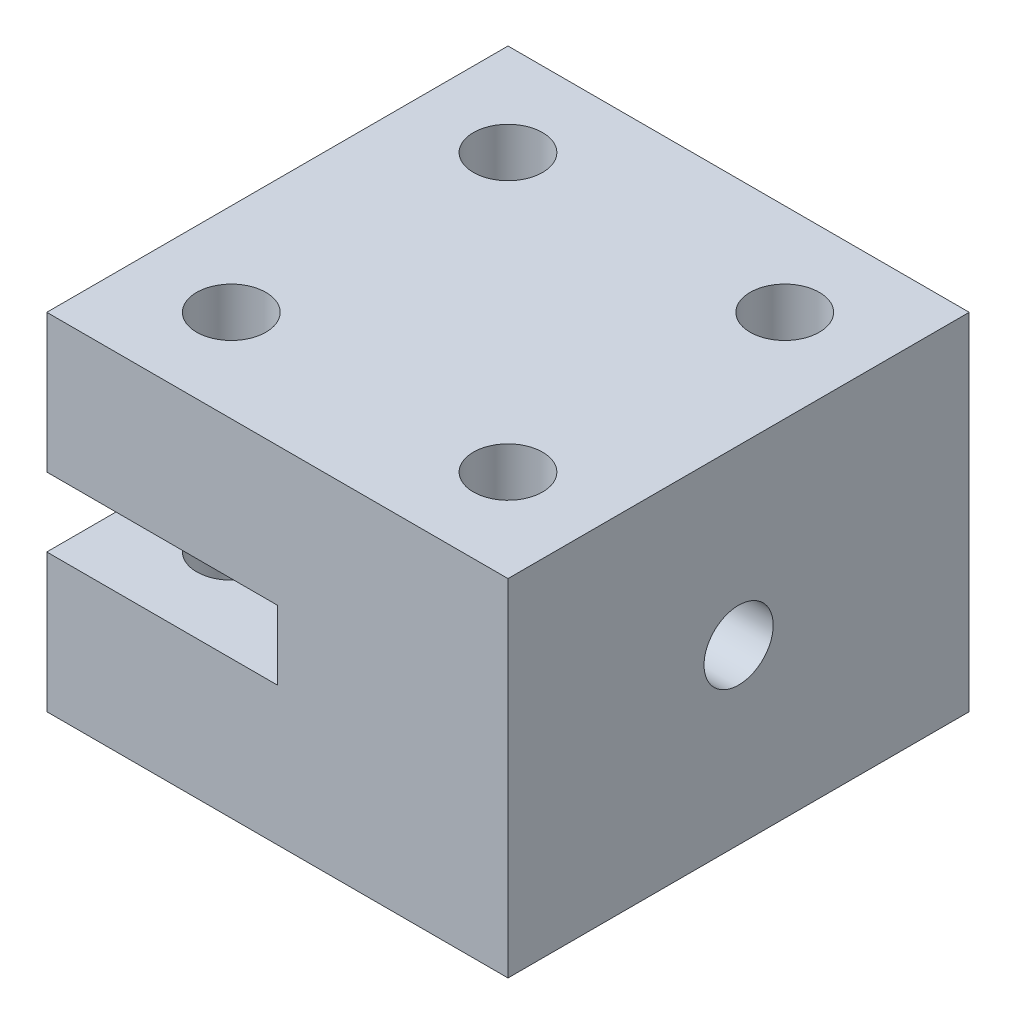
ISO-10303-21;
HEADER;
FILE_DESCRIPTION(('STEP AP214'),'2;1');
FILE_NAME('part.step','',(''),(''),'','','');
FILE_SCHEMA(('AUTOMOTIVE_DESIGN { 1 0 10303 214 1 1 1 1 }'));
ENDSEC;
DATA;
#1=APPLICATION_CONTEXT('core data for automotive mechanical design processes');
#2=APPLICATION_PROTOCOL_DEFINITION('international standard','automotive_design',2000,#1);
#3=PRODUCT_CONTEXT('',#1,'mechanical');
#4=PRODUCT('Part','Part','',(#3));
#5=PRODUCT_RELATED_PRODUCT_CATEGORY('part','',(#4));
#6=PRODUCT_DEFINITION_FORMATION('','',#4);
#7=PRODUCT_DEFINITION_CONTEXT('part definition',#1,'design');
#8=PRODUCT_DEFINITION('design','',#6,#7);
#9=PRODUCT_DEFINITION_SHAPE('','',#8);
#10=(LENGTH_UNIT() NAMED_UNIT(*) SI_UNIT(.MILLI.,.METRE.));
#11=(NAMED_UNIT(*) PLANE_ANGLE_UNIT() SI_UNIT($,.RADIAN.));
#12=(NAMED_UNIT(*) SI_UNIT($,.STERADIAN.) SOLID_ANGLE_UNIT());
#13=UNCERTAINTY_MEASURE_WITH_UNIT(LENGTH_MEASURE(1.E-05),#10,'distance_accuracy_value','');
#14=(GEOMETRIC_REPRESENTATION_CONTEXT(3) GLOBAL_UNCERTAINTY_ASSIGNED_CONTEXT((#13)) GLOBAL_UNIT_ASSIGNED_CONTEXT((#10,
#11,#12)) REPRESENTATION_CONTEXT('',''));
#15=CARTESIAN_POINT('',(0.,0.,0.));
#16=DIRECTION('',(0.,0.,1.));
#17=DIRECTION('',(1.,0.,0.));
#18=AXIS2_PLACEMENT_3D('',#15,#16,#17);
#19=CARTESIAN_POINT('',(9.99999999999999,7.5,-10.));
#20=DIRECTION('',(-1.,0.,0.));
#21=DIRECTION('',(0.,0.,1.));
#22=AXIS2_PLACEMENT_3D('',#19,#20,#21);
#23=PLANE('',#22);
#24=CARTESIAN_POINT('',(9.99999999999999,0.,0.));
#25=DIRECTION('',(1.,0.,0.));
#26=DIRECTION('',(0.,0.,-1.));
#27=AXIS2_PLACEMENT_3D('',#24,#25,#26);
#28=CIRCLE('',#27,1.5);
#29=CARTESIAN_POINT('',(9.99999999999999,0.,-1.5));
#30=VERTEX_POINT('',#29);
#31=EDGE_CURVE('E148',#30,#30,#28,.T.);
#32=ORIENTED_EDGE('',*,*,#31,.F.);
#33=EDGE_LOOP('',(#32));
#34=FACE_BOUND('',#33,.T.);
#35=DIRECTION('',(0.,-1.,0.));
#36=VECTOR('',#35,1.);
#37=CARTESIAN_POINT('',(9.99999999999999,7.5,-10.));
#38=LINE('',#37,#36);
#39=CARTESIAN_POINT('',(9.99999999999999,7.5,-10.));
#40=VERTEX_POINT('',#39);
#41=CARTESIAN_POINT('',(9.99999999999999,-7.5,-10.));
#42=VERTEX_POINT('',#41);
#43=EDGE_CURVE('E74',#40,#42,#38,.T.);
#44=ORIENTED_EDGE('',*,*,#43,.F.);
#45=DIRECTION('',(0.,0.,-1.));
#46=VECTOR('',#45,1.);
#47=CARTESIAN_POINT('',(9.99999999999999,7.5,-10.));
#48=LINE('',#47,#46);
#49=CARTESIAN_POINT('',(9.99999999999999,7.5,10.));
#50=VERTEX_POINT('',#49);
#51=EDGE_CURVE('E136',#50,#40,#48,.T.);
#52=ORIENTED_EDGE('',*,*,#51,.F.);
#53=DIRECTION('',(0.,-1.,0.));
#54=VECTOR('',#53,1.);
#55=CARTESIAN_POINT('',(9.99999999999999,7.5,10.));
#56=LINE('',#55,#54);
#57=CARTESIAN_POINT('',(9.99999999999999,-7.5,10.));
#58=VERTEX_POINT('',#57);
#59=EDGE_CURVE('E35',#50,#58,#56,.T.);
#60=ORIENTED_EDGE('',*,*,#59,.T.);
#61=DIRECTION('',(0.,0.,-1.));
#62=VECTOR('',#61,1.);
#63=CARTESIAN_POINT('',(9.99999999999999,-7.5,-10.));
#64=LINE('',#63,#62);
#65=EDGE_CURVE('E88',#58,#42,#64,.T.);
#66=ORIENTED_EDGE('',*,*,#65,.T.);
#67=EDGE_LOOP('',(#44,#52,#60,#66));
#68=FACE_BOUND('',#67,.T.);
#69=ADVANCED_FACE('F32',(#34,#68),#23,.F.);
#70=CARTESIAN_POINT('',(-10.,7.5,-10.));
#71=DIRECTION('',(0.,0.,1.));
#72=DIRECTION('',(1.,0.,0.));
#73=AXIS2_PLACEMENT_3D('',#70,#71,#72);
#74=PLANE('',#73);
#75=DIRECTION('',(-1.,0.,0.));
#76=VECTOR('',#75,1.);
#77=CARTESIAN_POINT('',(-10.,-1.5,-10.));
#78=LINE('',#77,#76);
#79=CARTESIAN_POINT('',(0.,-1.5,-10.));
#80=VERTEX_POINT('',#79);
#81=CARTESIAN_POINT('',(-10.,-1.5,-10.));
#82=VERTEX_POINT('',#81);
#83=EDGE_CURVE('E105',#80,#82,#78,.T.);
#84=ORIENTED_EDGE('',*,*,#83,.F.);
#85=DIRECTION('',(0.,-1.,0.));
#86=VECTOR('',#85,1.);
#87=CARTESIAN_POINT('',(0.,1.5,-10.));
#88=LINE('',#87,#86);
#89=CARTESIAN_POINT('',(0.,1.5,-10.));
#90=VERTEX_POINT('',#89);
#91=EDGE_CURVE('E116',#90,#80,#88,.T.);
#92=ORIENTED_EDGE('',*,*,#91,.F.);
#93=DIRECTION('',(-1.,0.,0.));
#94=VECTOR('',#93,1.);
#95=CARTESIAN_POINT('',(-10.,1.5,-10.));
#96=LINE('',#95,#94);
#97=CARTESIAN_POINT('',(-10.,1.5,-10.));
#98=VERTEX_POINT('',#97);
#99=EDGE_CURVE('E144',#90,#98,#96,.T.);
#100=ORIENTED_EDGE('',*,*,#99,.T.);
#101=DIRECTION('',(0.,-1.,0.));
#102=VECTOR('',#101,1.);
#103=CARTESIAN_POINT('',(-10.,7.5,-10.));
#104=LINE('',#103,#102);
#105=CARTESIAN_POINT('',(-10.,7.5,-10.));
#106=VERTEX_POINT('',#105);
#107=EDGE_CURVE('E121',#106,#98,#104,.T.);
#108=ORIENTED_EDGE('',*,*,#107,.F.);
#109=DIRECTION('',(-1.,0.,0.));
#110=VECTOR('',#109,1.);
#111=CARTESIAN_POINT('',(-10.,7.5,-10.));
#112=LINE('',#111,#110);
#113=EDGE_CURVE('E83',#40,#106,#112,.T.);
#114=ORIENTED_EDGE('',*,*,#113,.F.);
#115=ORIENTED_EDGE('',*,*,#43,.T.);
#116=DIRECTION('',(-1.,0.,0.));
#117=VECTOR('',#116,1.);
#118=CARTESIAN_POINT('',(-10.,-7.5,-10.));
#119=LINE('',#118,#117);
#120=CARTESIAN_POINT('',(-10.,-7.5,-10.));
#121=VERTEX_POINT('',#120);
#122=EDGE_CURVE('E78',#42,#121,#119,.T.);
#123=ORIENTED_EDGE('',*,*,#122,.T.);
#124=DIRECTION('',(0.,-1.,0.));
#125=VECTOR('',#124,1.);
#126=CARTESIAN_POINT('',(-10.,7.5,-10.));
#127=LINE('',#126,#125);
#128=EDGE_CURVE('E96',#82,#121,#127,.T.);
#129=ORIENTED_EDGE('',*,*,#128,.F.);
#130=EDGE_LOOP('',(#84,#92,#100,#108,#114,#115,#123,#129));
#131=FACE_BOUND('',#130,.T.);
#132=ADVANCED_FACE('F76',(#131),#74,.F.);
#133=CARTESIAN_POINT('',(-10.,7.5,-10.));
#134=DIRECTION('',(1.,0.,0.));
#135=DIRECTION('',(0.,0.,-1.));
#136=AXIS2_PLACEMENT_3D('',#133,#134,#135);
#137=PLANE('',#136);
#138=DIRECTION('',(0.,0.,1.));
#139=VECTOR('',#138,1.);
#140=CARTESIAN_POINT('',(-10.,-1.5,-10.));
#141=LINE('',#140,#139);
#142=CARTESIAN_POINT('',(-10.,-1.5,10.));
#143=VERTEX_POINT('',#142);
#144=EDGE_CURVE('E40',#82,#143,#141,.T.);
#145=ORIENTED_EDGE('',*,*,#144,.F.);
#146=ORIENTED_EDGE('',*,*,#128,.T.);
#147=DIRECTION('',(0.,0.,1.));
#148=VECTOR('',#147,1.);
#149=CARTESIAN_POINT('',(-10.,-7.5,-10.));
#150=LINE('',#149,#148);
#151=CARTESIAN_POINT('',(-10.,-7.5,10.));
#152=VERTEX_POINT('',#151);
#153=EDGE_CURVE('E95',#121,#152,#150,.T.);
#154=ORIENTED_EDGE('',*,*,#153,.T.);
#155=DIRECTION('',(0.,-1.,0.));
#156=VECTOR('',#155,1.);
#157=CARTESIAN_POINT('',(-10.,7.5,10.));
#158=LINE('',#157,#156);
#159=EDGE_CURVE('E108',#143,#152,#158,.T.);
#160=ORIENTED_EDGE('',*,*,#159,.F.);
#161=EDGE_LOOP('',(#145,#146,#154,#160));
#162=FACE_BOUND('',#161,.T.);
#163=ADVANCED_FACE('F244',(#162),#137,.F.);
#164=CARTESIAN_POINT('',(-10.,7.5,10.));
#165=DIRECTION('',(0.,0.,-1.));
#166=DIRECTION('',(-1.,0.,0.));
#167=AXIS2_PLACEMENT_3D('',#164,#165,#166);
#168=PLANE('',#167);
#169=DIRECTION('',(1.,0.,0.));
#170=VECTOR('',#169,1.);
#171=CARTESIAN_POINT('',(-10.,-1.5,10.));
#172=LINE('',#171,#170);
#173=CARTESIAN_POINT('',(0.,-1.5,10.));
#174=VERTEX_POINT('',#173);
#175=EDGE_CURVE('E11',#143,#174,#172,.T.);
#176=ORIENTED_EDGE('',*,*,#175,.F.);
#177=ORIENTED_EDGE('',*,*,#159,.T.);
#178=DIRECTION('',(1.,0.,0.));
#179=VECTOR('',#178,1.);
#180=CARTESIAN_POINT('',(-10.,-7.5,10.));
#181=LINE('',#180,#179);
#182=EDGE_CURVE('E106',#152,#58,#181,.T.);
#183=ORIENTED_EDGE('',*,*,#182,.T.);
#184=ORIENTED_EDGE('',*,*,#59,.F.);
#185=DIRECTION('',(1.,0.,0.));
#186=VECTOR('',#185,1.);
#187=CARTESIAN_POINT('',(-10.,7.5,10.));
#188=LINE('',#187,#186);
#189=CARTESIAN_POINT('',(-10.,7.5,10.));
#190=VERTEX_POINT('',#189);
#191=EDGE_CURVE('E129',#190,#50,#188,.T.);
#192=ORIENTED_EDGE('',*,*,#191,.F.);
#193=DIRECTION('',(0.,-1.,0.));
#194=VECTOR('',#193,1.);
#195=CARTESIAN_POINT('',(-10.,7.5,10.));
#196=LINE('',#195,#194);
#197=CARTESIAN_POINT('',(-10.,1.5,10.));
#198=VERTEX_POINT('',#197);
#199=EDGE_CURVE('E126',#190,#198,#196,.T.);
#200=ORIENTED_EDGE('',*,*,#199,.T.);
#201=DIRECTION('',(1.,0.,0.));
#202=VECTOR('',#201,1.);
#203=CARTESIAN_POINT('',(-10.,1.5,10.));
#204=LINE('',#203,#202);
#205=CARTESIAN_POINT('',(0.,1.5,10.));
#206=VERTEX_POINT('',#205);
#207=EDGE_CURVE('E138',#198,#206,#204,.T.);
#208=ORIENTED_EDGE('',*,*,#207,.T.);
#209=DIRECTION('',(0.,-1.,0.));
#210=VECTOR('',#209,1.);
#211=CARTESIAN_POINT('',(0.,1.5,10.));
#212=LINE('',#211,#210);
#213=EDGE_CURVE('E101',#206,#174,#212,.T.);
#214=ORIENTED_EDGE('',*,*,#213,.T.);
#215=EDGE_LOOP('',(#176,#177,#183,#184,#192,#200,#208,#214));
#216=FACE_BOUND('',#215,.T.);
#217=ADVANCED_FACE('F216',(#216),#168,.F.);
#218=CARTESIAN_POINT('',(0.,-7.5,0.));
#219=DIRECTION('',(0.,1.,0.));
#220=DIRECTION('',(0.,0.,1.));
#221=AXIS2_PLACEMENT_3D('',#218,#219,#220);
#222=PLANE('',#221);
#223=CARTESIAN_POINT('',(-6.,-7.5,6.));
#224=DIRECTION('',(0.,1.,0.));
#225=DIRECTION('',(0.,0.,1.));
#226=AXIS2_PLACEMENT_3D('',#223,#224,#225);
#227=CIRCLE('',#226,1.5);
#228=CARTESIAN_POINT('',(-6.,-7.5,7.5));
#229=VERTEX_POINT('',#228);
#230=EDGE_CURVE('E172',#229,#229,#227,.T.);
#231=ORIENTED_EDGE('',*,*,#230,.T.);
#232=EDGE_LOOP('',(#231));
#233=FACE_BOUND('',#232,.T.);
#234=CARTESIAN_POINT('',(6.,-7.5,6.));
#235=DIRECTION('',(0.,1.,0.));
#236=DIRECTION('',(0.,0.,1.));
#237=AXIS2_PLACEMENT_3D('',#234,#235,#236);
#238=CIRCLE('',#237,1.5);
#239=CARTESIAN_POINT('',(6.,-7.5,7.5));
#240=VERTEX_POINT('',#239);
#241=EDGE_CURVE('E179',#240,#240,#238,.T.);
#242=ORIENTED_EDGE('',*,*,#241,.T.);
#243=EDGE_LOOP('',(#242));
#244=FACE_BOUND('',#243,.T.);
#245=CARTESIAN_POINT('',(6.,-7.5,-6.));
#246=DIRECTION('',(0.,1.,0.));
#247=DIRECTION('',(0.,0.,1.));
#248=AXIS2_PLACEMENT_3D('',#245,#246,#247);
#249=CIRCLE('',#248,1.5);
#250=CARTESIAN_POINT('',(6.,-7.5,-4.5));
#251=VERTEX_POINT('',#250);
#252=EDGE_CURVE('E171',#251,#251,#249,.T.);
#253=ORIENTED_EDGE('',*,*,#252,.T.);
#254=EDGE_LOOP('',(#253));
#255=FACE_BOUND('',#254,.T.);
#256=CARTESIAN_POINT('',(-6.,-7.5,-6.));
#257=DIRECTION('',(0.,1.,0.));
#258=DIRECTION('',(0.,0.,1.));
#259=AXIS2_PLACEMENT_3D('',#256,#257,#258);
#260=CIRCLE('',#259,1.5);
#261=CARTESIAN_POINT('',(-6.,-7.5,-4.5));
#262=VERTEX_POINT('',#261);
#263=EDGE_CURVE('E165',#262,#262,#260,.T.);
#264=ORIENTED_EDGE('',*,*,#263,.T.);
#265=EDGE_LOOP('',(#264));
#266=FACE_BOUND('',#265,.T.);
#267=ORIENTED_EDGE('',*,*,#65,.F.);
#268=ORIENTED_EDGE('',*,*,#182,.F.);
#269=ORIENTED_EDGE('',*,*,#153,.F.);
#270=ORIENTED_EDGE('',*,*,#122,.F.);
#271=EDGE_LOOP('',(#267,#268,#269,#270));
#272=FACE_BOUND('',#271,.T.);
#273=ADVANCED_FACE('F92',(#233,#244,#255,#266,#272),#222,.F.);
#274=CARTESIAN_POINT('',(0.,-1.5,0.));
#275=DIRECTION('',(0.,1.,0.));
#276=DIRECTION('',(0.,0.,1.));
#277=AXIS2_PLACEMENT_3D('',#274,#275,#276);
#278=PLANE('',#277);
#279=CARTESIAN_POINT('',(-6.,-1.5,6.));
#280=DIRECTION('',(0.,1.,0.));
#281=DIRECTION('',(0.,0.,1.));
#282=AXIS2_PLACEMENT_3D('',#279,#280,#281);
#283=CIRCLE('',#282,1.5);
#284=CARTESIAN_POINT('',(-6.,-1.5,7.5));
#285=VERTEX_POINT('',#284);
#286=EDGE_CURVE('E151',#285,#285,#283,.T.);
#287=ORIENTED_EDGE('',*,*,#286,.F.);
#288=EDGE_LOOP('',(#287));
#289=FACE_BOUND('',#288,.T.);
#290=CARTESIAN_POINT('',(-6.,-1.5,-6.));
#291=DIRECTION('',(0.,1.,0.));
#292=DIRECTION('',(0.,0.,1.));
#293=AXIS2_PLACEMENT_3D('',#290,#291,#292);
#294=CIRCLE('',#293,1.5);
#295=CARTESIAN_POINT('',(-6.,-1.5,-4.5));
#296=VERTEX_POINT('',#295);
#297=EDGE_CURVE('E159',#296,#296,#294,.T.);
#298=ORIENTED_EDGE('',*,*,#297,.F.);
#299=EDGE_LOOP('',(#298));
#300=FACE_BOUND('',#299,.T.);
#301=DIRECTION('',(0.,0.,1.));
#302=VECTOR('',#301,1.);
#303=CARTESIAN_POINT('',(0.,-1.5,-10.));
#304=LINE('',#303,#302);
#305=EDGE_CURVE('E47',#80,#174,#304,.T.);
#306=ORIENTED_EDGE('',*,*,#305,.F.);
#307=ORIENTED_EDGE('',*,*,#83,.T.);
#308=ORIENTED_EDGE('',*,*,#144,.T.);
#309=ORIENTED_EDGE('',*,*,#175,.T.);
#310=EDGE_LOOP('',(#306,#307,#308,#309));
#311=FACE_BOUND('',#310,.T.);
#312=ADVANCED_FACE('F215',(#289,#300,#311),#278,.T.);
#313=CARTESIAN_POINT('',(0.,1.5,-10.));
#314=DIRECTION('',(1.,0.,0.));
#315=DIRECTION('',(0.,0.,-1.));
#316=AXIS2_PLACEMENT_3D('',#313,#314,#315);
#317=PLANE('',#316);
#318=ORIENTED_EDGE('',*,*,#305,.T.);
#319=ORIENTED_EDGE('',*,*,#213,.F.);
#320=DIRECTION('',(0.,0.,1.));
#321=VECTOR('',#320,1.);
#322=CARTESIAN_POINT('',(0.,1.5,-10.));
#323=LINE('',#322,#321);
#324=EDGE_CURVE('E119',#90,#206,#323,.T.);
#325=ORIENTED_EDGE('',*,*,#324,.F.);
#326=ORIENTED_EDGE('',*,*,#91,.T.);
#327=EDGE_LOOP('',(#318,#319,#325,#326));
#328=FACE_BOUND('',#327,.T.);
#329=ADVANCED_FACE('F219',(#328),#317,.F.);
#330=CARTESIAN_POINT('',(0.,1.5,0.));
#331=DIRECTION('',(0.,1.,0.));
#332=DIRECTION('',(0.,0.,1.));
#333=AXIS2_PLACEMENT_3D('',#330,#331,#332);
#334=PLANE('',#333);
#335=CARTESIAN_POINT('',(-6.,1.5,6.));
#336=DIRECTION('',(0.,1.,0.));
#337=DIRECTION('',(0.,0.,1.));
#338=AXIS2_PLACEMENT_3D('',#335,#336,#337);
#339=CIRCLE('',#338,1.5);
#340=CARTESIAN_POINT('',(-6.,1.5,7.5));
#341=VERTEX_POINT('',#340);
#342=EDGE_CURVE('E156',#341,#341,#339,.T.);
#343=ORIENTED_EDGE('',*,*,#342,.T.);
#344=EDGE_LOOP('',(#343));
#345=FACE_BOUND('',#344,.T.);
#346=CARTESIAN_POINT('',(-6.,1.5,-6.));
#347=DIRECTION('',(0.,1.,0.));
#348=DIRECTION('',(0.,0.,1.));
#349=AXIS2_PLACEMENT_3D('',#346,#347,#348);
#350=CIRCLE('',#349,1.5);
#351=CARTESIAN_POINT('',(-6.,1.5,-4.5));
#352=VERTEX_POINT('',#351);
#353=EDGE_CURVE('E162',#352,#352,#350,.T.);
#354=ORIENTED_EDGE('',*,*,#353,.T.);
#355=EDGE_LOOP('',(#354));
#356=FACE_BOUND('',#355,.T.);
#357=ORIENTED_EDGE('',*,*,#99,.F.);
#358=ORIENTED_EDGE('',*,*,#324,.T.);
#359=ORIENTED_EDGE('',*,*,#207,.F.);
#360=DIRECTION('',(0.,0.,1.));
#361=VECTOR('',#360,1.);
#362=CARTESIAN_POINT('',(-10.,1.5,-10.));
#363=LINE('',#362,#361);
#364=EDGE_CURVE('E141',#98,#198,#363,.T.);
#365=ORIENTED_EDGE('',*,*,#364,.F.);
#366=EDGE_LOOP('',(#357,#358,#359,#365));
#367=FACE_BOUND('',#366,.T.);
#368=ADVANCED_FACE('F196',(#345,#356,#367),#334,.F.);
#369=CARTESIAN_POINT('',(0.,7.5,0.));
#370=DIRECTION('',(0.,1.,0.));
#371=DIRECTION('',(0.,0.,1.));
#372=AXIS2_PLACEMENT_3D('',#369,#370,#371);
#373=PLANE('',#372);
#374=CARTESIAN_POINT('',(-6.,7.5,6.));
#375=DIRECTION('',(0.,1.,0.));
#376=DIRECTION('',(0.,0.,1.));
#377=AXIS2_PLACEMENT_3D('',#374,#375,#376);
#378=CIRCLE('',#377,1.5);
#379=CARTESIAN_POINT('',(-6.,7.5,7.5));
#380=VERTEX_POINT('',#379);
#381=EDGE_CURVE('E176',#380,#380,#378,.T.);
#382=ORIENTED_EDGE('',*,*,#381,.F.);
#383=EDGE_LOOP('',(#382));
#384=FACE_BOUND('',#383,.T.);
#385=CARTESIAN_POINT('',(6.,7.5,6.));
#386=DIRECTION('',(0.,1.,0.));
#387=DIRECTION('',(0.,0.,1.));
#388=AXIS2_PLACEMENT_3D('',#385,#386,#387);
#389=CIRCLE('',#388,1.5);
#390=CARTESIAN_POINT('',(6.,7.5,7.5));
#391=VERTEX_POINT('',#390);
#392=EDGE_CURVE('E175',#391,#391,#389,.T.);
#393=ORIENTED_EDGE('',*,*,#392,.F.);
#394=EDGE_LOOP('',(#393));
#395=FACE_BOUND('',#394,.T.);
#396=CARTESIAN_POINT('',(6.,7.5,-6.));
#397=DIRECTION('',(0.,1.,0.));
#398=DIRECTION('',(0.,0.,1.));
#399=AXIS2_PLACEMENT_3D('',#396,#397,#398);
#400=CIRCLE('',#399,1.5);
#401=CARTESIAN_POINT('',(6.,7.5,-4.5));
#402=VERTEX_POINT('',#401);
#403=EDGE_CURVE('E182',#402,#402,#400,.T.);
#404=ORIENTED_EDGE('',*,*,#403,.F.);
#405=EDGE_LOOP('',(#404));
#406=FACE_BOUND('',#405,.T.);
#407=CARTESIAN_POINT('',(-6.,7.5,-6.));
#408=DIRECTION('',(0.,1.,0.));
#409=DIRECTION('',(0.,0.,1.));
#410=AXIS2_PLACEMENT_3D('',#407,#408,#409);
#411=CIRCLE('',#410,1.5);
#412=CARTESIAN_POINT('',(-6.,7.5,-4.5));
#413=VERTEX_POINT('',#412);
#414=EDGE_CURVE('E168',#413,#413,#411,.T.);
#415=ORIENTED_EDGE('',*,*,#414,.F.);
#416=EDGE_LOOP('',(#415));
#417=FACE_BOUND('',#416,.T.);
#418=ORIENTED_EDGE('',*,*,#51,.T.);
#419=ORIENTED_EDGE('',*,*,#113,.T.);
#420=DIRECTION('',(0.,0.,1.));
#421=VECTOR('',#420,1.);
#422=CARTESIAN_POINT('',(-10.,7.5,-10.));
#423=LINE('',#422,#421);
#424=EDGE_CURVE('E132',#106,#190,#423,.T.);
#425=ORIENTED_EDGE('',*,*,#424,.T.);
#426=ORIENTED_EDGE('',*,*,#191,.T.);
#427=EDGE_LOOP('',(#418,#419,#425,#426));
#428=FACE_BOUND('',#427,.T.);
#429=ADVANCED_FACE('F192',(#384,#395,#406,#417,#428),#373,.T.);
#430=CARTESIAN_POINT('',(-10.,7.5,-10.));
#431=DIRECTION('',(1.,0.,0.));
#432=DIRECTION('',(0.,0.,-1.));
#433=AXIS2_PLACEMENT_3D('',#430,#431,#432);
#434=PLANE('',#433);
#435=ORIENTED_EDGE('',*,*,#107,.T.);
#436=ORIENTED_EDGE('',*,*,#364,.T.);
#437=ORIENTED_EDGE('',*,*,#199,.F.);
#438=ORIENTED_EDGE('',*,*,#424,.F.);
#439=EDGE_LOOP('',(#435,#436,#437,#438));
#440=FACE_BOUND('',#439,.T.);
#441=ADVANCED_FACE('F195',(#440),#434,.F.);
#442=CARTESIAN_POINT('',(2.49999999999999,0.,0.));
#443=DIRECTION('',(1.,0.,0.));
#444=DIRECTION('',(0.,0.,-1.));
#445=AXIS2_PLACEMENT_3D('',#442,#443,#444);
#446=CYLINDRICAL_SURFACE('',#445,1.5);
#447=CARTESIAN_POINT('',(2.49999999999999,0.,0.));
#448=DIRECTION('',(1.,0.,0.));
#449=DIRECTION('',(0.,0.,-1.));
#450=AXIS2_PLACEMENT_3D('',#447,#448,#449);
#451=CIRCLE('',#450,1.5);
#452=CARTESIAN_POINT('',(2.49999999999999,0.,-1.5));
#453=VERTEX_POINT('',#452);
#454=EDGE_CURVE('E147',#453,#453,#451,.T.);
#455=ORIENTED_EDGE('',*,*,#454,.F.);
#456=EDGE_LOOP('',(#455));
#457=FACE_BOUND('',#456,.T.);
#458=ORIENTED_EDGE('',*,*,#31,.T.);
#459=EDGE_LOOP('',(#458));
#460=FACE_BOUND('',#459,.T.);
#461=ADVANCED_FACE('F230',(#457,#460),#446,.F.);
#462=CARTESIAN_POINT('',(2.49999999999999,0.,0.));
#463=DIRECTION('',(1.,0.,0.));
#464=DIRECTION('',(0.,0.,-1.));
#465=AXIS2_PLACEMENT_3D('',#462,#463,#464);
#466=PLANE('',#465);
#467=ORIENTED_EDGE('',*,*,#454,.T.);
#468=EDGE_LOOP('',(#467));
#469=FACE_BOUND('',#468,.T.);
#470=ADVANCED_FACE('F235',(#469),#466,.T.);
#471=CARTESIAN_POINT('',(-6.,-7.5,-6.));
#472=DIRECTION('',(0.,1.,0.));
#473=DIRECTION('',(0.,0.,1.));
#474=AXIS2_PLACEMENT_3D('',#471,#472,#473);
#475=CYLINDRICAL_SURFACE('',#474,1.5);
#476=ORIENTED_EDGE('',*,*,#414,.T.);
#477=EDGE_LOOP('',(#476));
#478=FACE_BOUND('',#477,.T.);
#479=ORIENTED_EDGE('',*,*,#353,.F.);
#480=EDGE_LOOP('',(#479));
#481=FACE_BOUND('',#480,.T.);
#482=ADVANCED_FACE('F271',(#478,#481),#475,.F.);
#483=CARTESIAN_POINT('',(6.,-7.5,-6.));
#484=DIRECTION('',(0.,1.,0.));
#485=DIRECTION('',(0.,0.,1.));
#486=AXIS2_PLACEMENT_3D('',#483,#484,#485);
#487=CYLINDRICAL_SURFACE('',#486,1.5);
#488=ORIENTED_EDGE('',*,*,#252,.F.);
#489=EDGE_LOOP('',(#488));
#490=FACE_BOUND('',#489,.T.);
#491=ORIENTED_EDGE('',*,*,#403,.T.);
#492=EDGE_LOOP('',(#491));
#493=FACE_BOUND('',#492,.T.);
#494=ADVANCED_FACE('F190',(#490,#493),#487,.F.);
#495=CARTESIAN_POINT('',(6.,-7.5,6.));
#496=DIRECTION('',(0.,1.,0.));
#497=DIRECTION('',(0.,0.,1.));
#498=AXIS2_PLACEMENT_3D('',#495,#496,#497);
#499=CYLINDRICAL_SURFACE('',#498,1.5);
#500=ORIENTED_EDGE('',*,*,#241,.F.);
#501=EDGE_LOOP('',(#500));
#502=FACE_BOUND('',#501,.T.);
#503=ORIENTED_EDGE('',*,*,#392,.T.);
#504=EDGE_LOOP('',(#503));
#505=FACE_BOUND('',#504,.T.);
#506=ADVANCED_FACE('F282',(#502,#505),#499,.F.);
#507=CARTESIAN_POINT('',(-6.,-7.5,6.));
#508=DIRECTION('',(0.,1.,0.));
#509=DIRECTION('',(0.,0.,1.));
#510=AXIS2_PLACEMENT_3D('',#507,#508,#509);
#511=CYLINDRICAL_SURFACE('',#510,1.5);
#512=ORIENTED_EDGE('',*,*,#381,.T.);
#513=EDGE_LOOP('',(#512));
#514=FACE_BOUND('',#513,.T.);
#515=ORIENTED_EDGE('',*,*,#342,.F.);
#516=EDGE_LOOP('',(#515));
#517=FACE_BOUND('',#516,.T.);
#518=ADVANCED_FACE('F277',(#514,#517),#511,.F.);
#519=ORIENTED_EDGE('',*,*,#297,.T.);
#520=EDGE_LOOP('',(#519));
#521=FACE_BOUND('',#520,.T.);
#522=ORIENTED_EDGE('',*,*,#263,.F.);
#523=EDGE_LOOP('',(#522));
#524=FACE_BOUND('',#523,.T.);
#525=ADVANCED_FACE('F273',(#521,#524),#475,.F.);
#526=ORIENTED_EDGE('',*,*,#286,.T.);
#527=EDGE_LOOP('',(#526));
#528=FACE_BOUND('',#527,.T.);
#529=ORIENTED_EDGE('',*,*,#230,.F.);
#530=EDGE_LOOP('',(#529));
#531=FACE_BOUND('',#530,.T.);
#532=ADVANCED_FACE('F276',(#528,#531),#511,.F.);
#533=CLOSED_SHELL('',(#69,#132,#163,#217,#273,#312,#329,#368,#429,#441,#461,#470,#482,#494,#506,
#518,#525,#532));
#534=MANIFOLD_SOLID_BREP('B2',#533);
#535=ADVANCED_BREP_SHAPE_REPRESENTATION('',(#18,#534),#14);
#536=SHAPE_DEFINITION_REPRESENTATION(#9,#535);
ENDSEC;
END-ISO-10303-21;
